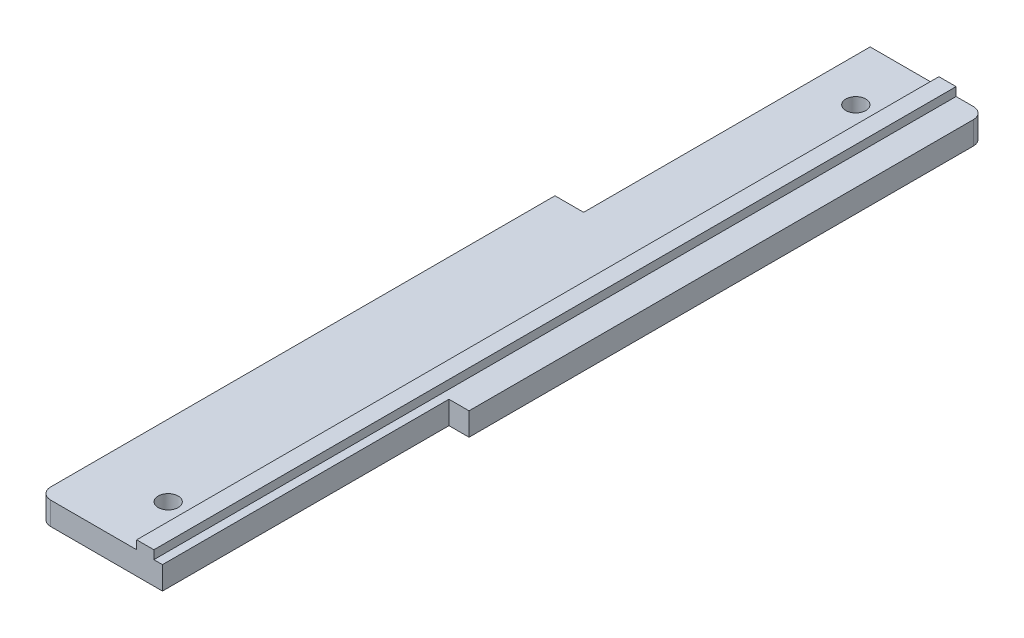
ISO-10303-21;
HEADER;
FILE_DESCRIPTION(('STEP AP214'),'2;1');
FILE_NAME('part.step','',(''),(''),'','','');
FILE_SCHEMA(('AUTOMOTIVE_DESIGN { 1 0 10303 214 1 1 1 1 }'));
ENDSEC;
DATA;
#1=APPLICATION_CONTEXT('core data for automotive mechanical design processes');
#2=APPLICATION_PROTOCOL_DEFINITION('international standard','automotive_design',2000,#1);
#3=PRODUCT_CONTEXT('',#1,'mechanical');
#4=PRODUCT('Part','Part','',(#3));
#5=PRODUCT_RELATED_PRODUCT_CATEGORY('part','',(#4));
#6=PRODUCT_DEFINITION_FORMATION('','',#4);
#7=PRODUCT_DEFINITION_CONTEXT('part definition',#1,'design');
#8=PRODUCT_DEFINITION('design','',#6,#7);
#9=PRODUCT_DEFINITION_SHAPE('','',#8);
#10=(LENGTH_UNIT() NAMED_UNIT(*) SI_UNIT(.MILLI.,.METRE.));
#11=(NAMED_UNIT(*) PLANE_ANGLE_UNIT() SI_UNIT($,.RADIAN.));
#12=(NAMED_UNIT(*) SI_UNIT($,.STERADIAN.) SOLID_ANGLE_UNIT());
#13=UNCERTAINTY_MEASURE_WITH_UNIT(LENGTH_MEASURE(1.E-05),#10,'distance_accuracy_value','');
#14=(GEOMETRIC_REPRESENTATION_CONTEXT(3) GLOBAL_UNCERTAINTY_ASSIGNED_CONTEXT((#13)) GLOBAL_UNIT_ASSIGNED_CONTEXT((#10,
#11,#12)) REPRESENTATION_CONTEXT('',''));
#15=CARTESIAN_POINT('',(0.,0.,0.));
#16=DIRECTION('',(0.,0.,1.));
#17=DIRECTION('',(1.,0.,0.));
#18=AXIS2_PLACEMENT_3D('',#15,#16,#17);
#19=CARTESIAN_POINT('',(0.,4.,0.));
#20=DIRECTION('',(0.,-1.,0.));
#21=DIRECTION('',(0.,0.,-1.));
#22=AXIS2_PLACEMENT_3D('',#19,#20,#21);
#23=PLANE('',#22);
#24=CARTESIAN_POINT('',(0.,4.,60.));
#25=DIRECTION('',(0.,1.,0.));
#26=DIRECTION('',(0.,0.,-1.));
#27=AXIS2_PLACEMENT_3D('',#24,#25,#26);
#28=CIRCLE('',#27,1.75);
#29=CARTESIAN_POINT('',(0.,4.,58.25));
#30=VERTEX_POINT('',#29);
#31=EDGE_CURVE('E176',#30,#30,#28,.T.);
#32=ORIENTED_EDGE('',*,*,#31,.F.);
#33=EDGE_LOOP('',(#32));
#34=FACE_BOUND('',#33,.T.);
#35=CARTESIAN_POINT('',(0.,4.,-60.));
#36=DIRECTION('',(0.,1.,0.));
#37=DIRECTION('',(0.,0.,1.));
#38=AXIS2_PLACEMENT_3D('',#35,#36,#37);
#39=CIRCLE('',#38,1.75);
#40=CARTESIAN_POINT('',(0.,4.,-58.25));
#41=VERTEX_POINT('',#40);
#42=EDGE_CURVE('E215',#41,#41,#39,.T.);
#43=ORIENTED_EDGE('',*,*,#42,.F.);
#44=EDGE_LOOP('',(#43));
#45=FACE_BOUND('',#44,.T.);
#46=DIRECTION('',(-1.,0.,0.));
#47=VECTOR('',#46,1.);
#48=CARTESIAN_POINT('',(-12.5,4.,-70.));
#49=LINE('',#48,#47);
#50=CARTESIAN_POINT('',(4.50000000000001,4.,-70.));
#51=VERTEX_POINT('',#50);
#52=CARTESIAN_POINT('',(-7.5,4.,-70.));
#53=VERTEX_POINT('',#52);
#54=EDGE_CURVE('E166',#51,#53,#49,.T.);
#55=ORIENTED_EDGE('',*,*,#54,.T.);
#56=DIRECTION('',(0.,0.,-1.));
#57=VECTOR('',#56,1.);
#58=CARTESIAN_POINT('',(-7.5,4.,-70.));
#59=LINE('',#58,#57);
#60=CARTESIAN_POINT('',(-7.49999999999999,4.,-20.));
#61=VERTEX_POINT('',#60);
#62=EDGE_CURVE('E283',#61,#53,#59,.T.);
#63=ORIENTED_EDGE('',*,*,#62,.F.);
#64=DIRECTION('',(1.,0.,0.));
#65=VECTOR('',#64,1.);
#66=CARTESIAN_POINT('',(-7.49999999999999,4.,-20.));
#67=LINE('',#66,#65);
#68=CARTESIAN_POINT('',(-12.5,4.,-20.));
#69=VERTEX_POINT('',#68);
#70=EDGE_CURVE('E309',#69,#61,#67,.T.);
#71=ORIENTED_EDGE('',*,*,#70,.F.);
#72=DIRECTION('',(0.,0.,1.));
#73=VECTOR('',#72,1.);
#74=CARTESIAN_POINT('',(-12.5,4.,70.));
#75=LINE('',#74,#73);
#76=CARTESIAN_POINT('',(-12.5,4.,68.));
#77=VERTEX_POINT('',#76);
#78=EDGE_CURVE('E179',#69,#77,#75,.T.);
#79=ORIENTED_EDGE('',*,*,#78,.T.);
#80=CARTESIAN_POINT('',(-10.5,4.,68.));
#81=DIRECTION('',(0.,-1.,0.));
#82=DIRECTION('',(0.,0.,-1.));
#83=AXIS2_PLACEMENT_3D('',#80,#81,#82);
#84=CIRCLE('',#83,2.);
#85=CARTESIAN_POINT('',(-10.5,4.,70.));
#86=VERTEX_POINT('',#85);
#87=EDGE_CURVE('E201',#77,#86,#84,.F.);
#88=ORIENTED_EDGE('',*,*,#87,.T.);
#89=DIRECTION('',(1.,0.,0.));
#90=VECTOR('',#89,1.);
#91=CARTESIAN_POINT('',(-12.5,4.,70.));
#92=LINE('',#91,#90);
#93=CARTESIAN_POINT('',(4.50000000000001,4.,70.));
#94=VERTEX_POINT('',#93);
#95=EDGE_CURVE('E182',#86,#94,#92,.T.);
#96=ORIENTED_EDGE('',*,*,#95,.T.);
#97=DIRECTION('',(0.,0.,1.));
#98=VECTOR('',#97,1.);
#99=CARTESIAN_POINT('',(4.5,4.,-70.));
#100=LINE('',#99,#98);
#101=EDGE_CURVE('E239',#51,#94,#100,.T.);
#102=ORIENTED_EDGE('',*,*,#101,.F.);
#103=EDGE_LOOP('',(#55,#63,#71,#79,#88,#96,#102));
#104=FACE_BOUND('',#103,.T.);
#105=ADVANCED_FACE('F47',(#34,#45,#104),#23,.F.);
#106=CARTESIAN_POINT('',(7.50000000000001,4.,70.));
#107=VERTEX_POINT('',#106);
#108=CARTESIAN_POINT('',(9.00000000000001,4.,70.));
#109=VERTEX_POINT('',#108);
#110=EDGE_CURVE('E181',#107,#109,#92,.T.);
#111=ORIENTED_EDGE('',*,*,#110,.T.);
#112=DIRECTION('',(0.,0.,1.));
#113=VECTOR('',#112,1.);
#114=CARTESIAN_POINT('',(9.,4.,20.));
#115=LINE('',#114,#113);
#116=CARTESIAN_POINT('',(9.,4.,20.));
#117=VERTEX_POINT('',#116);
#118=EDGE_CURVE('E154',#117,#109,#115,.T.);
#119=ORIENTED_EDGE('',*,*,#118,.F.);
#120=DIRECTION('',(-1.,0.,0.));
#121=VECTOR('',#120,1.);
#122=CARTESIAN_POINT('',(12.5,4.,20.));
#123=LINE('',#122,#121);
#124=CARTESIAN_POINT('',(12.5,4.,20.));
#125=VERTEX_POINT('',#124);
#126=EDGE_CURVE('E148',#125,#117,#123,.T.);
#127=ORIENTED_EDGE('',*,*,#126,.F.);
#128=DIRECTION('',(0.,0.,-1.));
#129=VECTOR('',#128,1.);
#130=CARTESIAN_POINT('',(12.5,4.,70.));
#131=LINE('',#130,#129);
#132=CARTESIAN_POINT('',(12.5,4.,-68.));
#133=VERTEX_POINT('',#132);
#134=EDGE_CURVE('E159',#125,#133,#131,.T.);
#135=ORIENTED_EDGE('',*,*,#134,.T.);
#136=CARTESIAN_POINT('',(10.5,4.,-68.));
#137=DIRECTION('',(0.,-1.,0.));
#138=DIRECTION('',(0.,0.,-1.));
#139=AXIS2_PLACEMENT_3D('',#136,#137,#138);
#140=CIRCLE('',#139,2.);
#141=CARTESIAN_POINT('',(10.5,4.,-70.));
#142=VERTEX_POINT('',#141);
#143=EDGE_CURVE('E203',#133,#142,#140,.F.);
#144=ORIENTED_EDGE('',*,*,#143,.T.);
#145=CARTESIAN_POINT('',(7.5,4.,-70.));
#146=VERTEX_POINT('',#145);
#147=EDGE_CURVE('E170',#142,#146,#49,.T.);
#148=ORIENTED_EDGE('',*,*,#147,.T.);
#149=DIRECTION('',(0.,0.,-1.));
#150=VECTOR('',#149,1.);
#151=CARTESIAN_POINT('',(7.5,4.,-70.));
#152=LINE('',#151,#150);
#153=EDGE_CURVE('E242',#107,#146,#152,.T.);
#154=ORIENTED_EDGE('',*,*,#153,.F.);
#155=EDGE_LOOP('',(#111,#119,#127,#135,#144,#148,#154));
#156=FACE_BOUND('',#155,.T.);
#157=ADVANCED_FACE('F158',(#156),#23,.F.);
#158=CARTESIAN_POINT('',(12.5,4.,70.));
#159=DIRECTION('',(-1.,0.,0.));
#160=DIRECTION('',(0.,0.,1.));
#161=AXIS2_PLACEMENT_3D('',#158,#159,#160);
#162=PLANE('',#161);
#163=ORIENTED_EDGE('',*,*,#134,.F.);
#164=DIRECTION('',(0.,1.,0.));
#165=VECTOR('',#164,1.);
#166=CARTESIAN_POINT('',(12.5,-41.,20.));
#167=LINE('',#166,#165);
#168=CARTESIAN_POINT('',(12.5,0.,20.));
#169=VERTEX_POINT('',#168);
#170=EDGE_CURVE('E145',#169,#125,#167,.T.);
#171=ORIENTED_EDGE('',*,*,#170,.F.);
#172=DIRECTION('',(0.,0.,-1.));
#173=VECTOR('',#172,1.);
#174=CARTESIAN_POINT('',(12.5,0.,70.));
#175=LINE('',#174,#173);
#176=CARTESIAN_POINT('',(12.5,0.,-68.));
#177=VERTEX_POINT('',#176);
#178=EDGE_CURVE('E185',#169,#177,#175,.T.);
#179=ORIENTED_EDGE('',*,*,#178,.T.);
#180=DIRECTION('',(0.,-1.,0.));
#181=VECTOR('',#180,1.);
#182=CARTESIAN_POINT('',(12.5,4.,-68.));
#183=LINE('',#182,#181);
#184=EDGE_CURVE('E164',#177,#133,#183,.F.);
#185=ORIENTED_EDGE('',*,*,#184,.T.);
#186=EDGE_LOOP('',(#163,#171,#179,#185));
#187=FACE_BOUND('',#186,.T.);
#188=ADVANCED_FACE('F162',(#187),#162,.F.);
#189=CARTESIAN_POINT('',(-12.5,4.,-70.));
#190=DIRECTION('',(0.,0.,1.));
#191=DIRECTION('',(1.,0.,0.));
#192=AXIS2_PLACEMENT_3D('',#189,#190,#191);
#193=PLANE('',#192);
#194=DIRECTION('',(-1.,0.,0.));
#195=VECTOR('',#194,1.);
#196=CARTESIAN_POINT('',(-12.5,0.,-70.));
#197=LINE('',#196,#195);
#198=CARTESIAN_POINT('',(10.5,0.,-70.));
#199=VERTEX_POINT('',#198);
#200=CARTESIAN_POINT('',(-7.5,0.,-70.));
#201=VERTEX_POINT('',#200);
#202=EDGE_CURVE('E187',#199,#201,#197,.T.);
#203=ORIENTED_EDGE('',*,*,#202,.T.);
#204=DIRECTION('',(0.,1.,0.));
#205=VECTOR('',#204,1.);
#206=CARTESIAN_POINT('',(-7.5,-6.,-70.));
#207=LINE('',#206,#205);
#208=EDGE_CURVE('E225',#201,#53,#207,.T.);
#209=ORIENTED_EDGE('',*,*,#208,.T.);
#210=ORIENTED_EDGE('',*,*,#54,.F.);
#211=DIRECTION('',(0.,-1.,0.));
#212=VECTOR('',#211,1.);
#213=CARTESIAN_POINT('',(4.5,5.5,-70.));
#214=LINE('',#213,#212);
#215=CARTESIAN_POINT('',(4.5,5.5,-70.));
#216=VERTEX_POINT('',#215);
#217=EDGE_CURVE('E255',#216,#51,#214,.T.);
#218=ORIENTED_EDGE('',*,*,#217,.F.);
#219=DIRECTION('',(-1.,0.,0.));
#220=VECTOR('',#219,1.);
#221=CARTESIAN_POINT('',(4.5,5.5,-70.));
#222=LINE('',#221,#220);
#223=CARTESIAN_POINT('',(7.5,5.5,-70.));
#224=VERTEX_POINT('',#223);
#225=EDGE_CURVE('E254',#224,#216,#222,.T.);
#226=ORIENTED_EDGE('',*,*,#225,.F.);
#227=DIRECTION('',(0.,-1.,0.));
#228=VECTOR('',#227,1.);
#229=CARTESIAN_POINT('',(7.5,5.5,-70.));
#230=LINE('',#229,#228);
#231=EDGE_CURVE('E261',#224,#146,#230,.T.);
#232=ORIENTED_EDGE('',*,*,#231,.T.);
#233=ORIENTED_EDGE('',*,*,#147,.F.);
#234=DIRECTION('',(0.,-1.,0.));
#235=VECTOR('',#234,1.);
#236=CARTESIAN_POINT('',(10.5,4.,-70.));
#237=LINE('',#236,#235);
#238=EDGE_CURVE('E184',#142,#199,#237,.T.);
#239=ORIENTED_EDGE('',*,*,#238,.T.);
#240=EDGE_LOOP('',(#203,#209,#210,#218,#226,#232,#233,#239));
#241=FACE_BOUND('',#240,.T.);
#242=ADVANCED_FACE('F286',(#241),#193,.F.);
#243=CARTESIAN_POINT('',(-12.5,4.,70.));
#244=DIRECTION('',(1.,0.,0.));
#245=DIRECTION('',(0.,0.,-1.));
#246=AXIS2_PLACEMENT_3D('',#243,#244,#245);
#247=PLANE('',#246);
#248=ORIENTED_EDGE('',*,*,#78,.F.);
#249=DIRECTION('',(0.,-1.,0.));
#250=VECTOR('',#249,1.);
#251=CARTESIAN_POINT('',(-12.5,4.,-20.));
#252=LINE('',#251,#250);
#253=CARTESIAN_POINT('',(-12.5,0.,-20.));
#254=VERTEX_POINT('',#253);
#255=EDGE_CURVE('E234',#69,#254,#252,.T.);
#256=ORIENTED_EDGE('',*,*,#255,.T.);
#257=DIRECTION('',(0.,0.,1.));
#258=VECTOR('',#257,1.);
#259=CARTESIAN_POINT('',(-12.5,0.,70.));
#260=LINE('',#259,#258);
#261=CARTESIAN_POINT('',(-12.5,0.,68.));
#262=VERTEX_POINT('',#261);
#263=EDGE_CURVE('E173',#254,#262,#260,.T.);
#264=ORIENTED_EDGE('',*,*,#263,.T.);
#265=DIRECTION('',(0.,-1.,0.));
#266=VECTOR('',#265,1.);
#267=CARTESIAN_POINT('',(-12.5,4.,68.));
#268=LINE('',#267,#266);
#269=EDGE_CURVE('E205',#262,#77,#268,.F.);
#270=ORIENTED_EDGE('',*,*,#269,.T.);
#271=EDGE_LOOP('',(#248,#256,#264,#270));
#272=FACE_BOUND('',#271,.T.);
#273=ADVANCED_FACE('F238',(#272),#247,.F.);
#274=CARTESIAN_POINT('',(-12.5,4.,70.));
#275=DIRECTION('',(0.,0.,-1.));
#276=DIRECTION('',(-1.,0.,0.));
#277=AXIS2_PLACEMENT_3D('',#274,#275,#276);
#278=PLANE('',#277);
#279=DIRECTION('',(1.,0.,0.));
#280=VECTOR('',#279,1.);
#281=CARTESIAN_POINT('',(-12.5,0.,70.));
#282=LINE('',#281,#280);
#283=CARTESIAN_POINT('',(-10.5,0.,70.));
#284=VERTEX_POINT('',#283);
#285=CARTESIAN_POINT('',(9.00000000000001,0.,70.));
#286=VERTEX_POINT('',#285);
#287=EDGE_CURVE('E167',#284,#286,#282,.T.);
#288=ORIENTED_EDGE('',*,*,#287,.T.);
#289=DIRECTION('',(0.,1.,0.));
#290=VECTOR('',#289,1.);
#291=CARTESIAN_POINT('',(9.00000000000001,-41.,70.));
#292=LINE('',#291,#290);
#293=EDGE_CURVE('E305',#286,#109,#292,.T.);
#294=ORIENTED_EDGE('',*,*,#293,.T.);
#295=ORIENTED_EDGE('',*,*,#110,.F.);
#296=DIRECTION('',(0.,-1.,0.));
#297=VECTOR('',#296,1.);
#298=CARTESIAN_POINT('',(7.50000000000002,5.5,70.));
#299=LINE('',#298,#297);
#300=CARTESIAN_POINT('',(7.50000000000002,5.5,70.));
#301=VERTEX_POINT('',#300);
#302=EDGE_CURVE('E264',#301,#107,#299,.T.);
#303=ORIENTED_EDGE('',*,*,#302,.F.);
#304=DIRECTION('',(1.,0.,0.));
#305=VECTOR('',#304,1.);
#306=CARTESIAN_POINT('',(4.50000000000002,5.5,70.));
#307=LINE('',#306,#305);
#308=CARTESIAN_POINT('',(4.50000000000002,5.5,70.));
#309=VERTEX_POINT('',#308);
#310=EDGE_CURVE('E250',#309,#301,#307,.T.);
#311=ORIENTED_EDGE('',*,*,#310,.F.);
#312=DIRECTION('',(0.,-1.,0.));
#313=VECTOR('',#312,1.);
#314=CARTESIAN_POINT('',(4.50000000000002,5.5,70.));
#315=LINE('',#314,#313);
#316=EDGE_CURVE('E267',#309,#94,#315,.T.);
#317=ORIENTED_EDGE('',*,*,#316,.T.);
#318=ORIENTED_EDGE('',*,*,#95,.F.);
#319=DIRECTION('',(0.,-1.,0.));
#320=VECTOR('',#319,1.);
#321=CARTESIAN_POINT('',(-10.5,4.,70.));
#322=LINE('',#321,#320);
#323=EDGE_CURVE('E208',#86,#284,#322,.T.);
#324=ORIENTED_EDGE('',*,*,#323,.T.);
#325=EDGE_LOOP('',(#288,#294,#295,#303,#311,#317,#318,#324));
#326=FACE_BOUND('',#325,.T.);
#327=ADVANCED_FACE('F304',(#326),#278,.F.);
#328=CARTESIAN_POINT('',(0.,0.,0.));
#329=DIRECTION('',(0.,-1.,0.));
#330=DIRECTION('',(0.,0.,-1.));
#331=AXIS2_PLACEMENT_3D('',#328,#329,#330);
#332=PLANE('',#331);
#333=DIRECTION('',(0.,0.,-1.));
#334=VECTOR('',#333,1.);
#335=CARTESIAN_POINT('',(8.99999999999999,0.,0.));
#336=LINE('',#335,#334);
#337=CARTESIAN_POINT('',(9.,0.,20.));
#338=VERTEX_POINT('',#337);
#339=EDGE_CURVE('E11',#286,#338,#336,.T.);
#340=ORIENTED_EDGE('',*,*,#339,.F.);
#341=ORIENTED_EDGE('',*,*,#287,.F.);
#342=CARTESIAN_POINT('',(-10.5,0.,68.));
#343=DIRECTION('',(0.,-1.,0.));
#344=DIRECTION('',(0.,0.,-1.));
#345=AXIS2_PLACEMENT_3D('',#342,#343,#344);
#346=CIRCLE('',#345,2.);
#347=EDGE_CURVE('E194',#284,#262,#346,.T.);
#348=ORIENTED_EDGE('',*,*,#347,.T.);
#349=ORIENTED_EDGE('',*,*,#263,.F.);
#350=DIRECTION('',(-1.,0.,0.));
#351=VECTOR('',#350,1.);
#352=CARTESIAN_POINT('',(0.,0.,-20.));
#353=LINE('',#352,#351);
#354=CARTESIAN_POINT('',(-7.49999999999999,0.,-20.));
#355=VERTEX_POINT('',#354);
#356=EDGE_CURVE('E211',#355,#254,#353,.T.);
#357=ORIENTED_EDGE('',*,*,#356,.F.);
#358=DIRECTION('',(0.,0.,1.));
#359=VECTOR('',#358,1.);
#360=CARTESIAN_POINT('',(-7.49999999999999,0.,0.));
#361=LINE('',#360,#359);
#362=EDGE_CURVE('E219',#201,#355,#361,.T.);
#363=ORIENTED_EDGE('',*,*,#362,.F.);
#364=ORIENTED_EDGE('',*,*,#202,.F.);
#365=CARTESIAN_POINT('',(10.5,0.,-68.));
#366=DIRECTION('',(0.,-1.,0.));
#367=DIRECTION('',(0.,0.,-1.));
#368=AXIS2_PLACEMENT_3D('',#365,#366,#367);
#369=CIRCLE('',#368,2.);
#370=EDGE_CURVE('E197',#199,#177,#369,.T.);
#371=ORIENTED_EDGE('',*,*,#370,.T.);
#372=ORIENTED_EDGE('',*,*,#178,.F.);
#373=DIRECTION('',(1.,0.,0.));
#374=VECTOR('',#373,1.);
#375=CARTESIAN_POINT('',(0.,0.,20.));
#376=LINE('',#375,#374);
#377=EDGE_CURVE('E55',#338,#169,#376,.T.);
#378=ORIENTED_EDGE('',*,*,#377,.F.);
#379=EDGE_LOOP('',(#340,#341,#348,#349,#357,#363,#364,#371,#372,#378));
#380=FACE_BOUND('',#379,.T.);
#381=CARTESIAN_POINT('',(0.,0.,-60.));
#382=DIRECTION('',(0.,-1.,0.));
#383=DIRECTION('',(0.,0.,-1.));
#384=AXIS2_PLACEMENT_3D('',#381,#382,#383);
#385=CIRCLE('',#384,1.75);
#386=CARTESIAN_POINT('',(0.,0.,-61.75));
#387=VERTEX_POINT('',#386);
#388=EDGE_CURVE('E188',#387,#387,#385,.T.);
#389=ORIENTED_EDGE('',*,*,#388,.F.);
#390=EDGE_LOOP('',(#389));
#391=FACE_BOUND('',#390,.T.);
#392=CARTESIAN_POINT('',(0.,0.,60.));
#393=DIRECTION('',(0.,-1.,0.));
#394=DIRECTION('',(0.,0.,-1.));
#395=AXIS2_PLACEMENT_3D('',#392,#393,#394);
#396=CIRCLE('',#395,1.75);
#397=CARTESIAN_POINT('',(0.,0.,58.25));
#398=VERTEX_POINT('',#397);
#399=EDGE_CURVE('E212',#398,#398,#396,.T.);
#400=ORIENTED_EDGE('',*,*,#399,.F.);
#401=EDGE_LOOP('',(#400));
#402=FACE_BOUND('',#401,.T.);
#403=ADVANCED_FACE('F230',(#380,#391,#402),#332,.T.);
#404=CARTESIAN_POINT('',(10.5,4.,-68.));
#405=DIRECTION('',(0.,-1.,0.));
#406=DIRECTION('',(0.,0.,-1.));
#407=AXIS2_PLACEMENT_3D('',#404,#405,#406);
#408=CYLINDRICAL_SURFACE('',#407,2.);
#409=ORIENTED_EDGE('',*,*,#143,.F.);
#410=ORIENTED_EDGE('',*,*,#184,.F.);
#411=ORIENTED_EDGE('',*,*,#370,.F.);
#412=ORIENTED_EDGE('',*,*,#238,.F.);
#413=EDGE_LOOP('',(#409,#410,#411,#412));
#414=FACE_BOUND('',#413,.T.);
#415=ADVANCED_FACE('F346',(#414),#408,.T.);
#416=CARTESIAN_POINT('',(-10.5,4.,68.));
#417=DIRECTION('',(0.,-1.,0.));
#418=DIRECTION('',(0.,0.,-1.));
#419=AXIS2_PLACEMENT_3D('',#416,#417,#418);
#420=CYLINDRICAL_SURFACE('',#419,2.);
#421=ORIENTED_EDGE('',*,*,#87,.F.);
#422=ORIENTED_EDGE('',*,*,#269,.F.);
#423=ORIENTED_EDGE('',*,*,#347,.F.);
#424=ORIENTED_EDGE('',*,*,#323,.F.);
#425=EDGE_LOOP('',(#421,#422,#423,#424));
#426=FACE_BOUND('',#425,.T.);
#427=ADVANCED_FACE('F49',(#426),#420,.T.);
#428=CARTESIAN_POINT('',(0.,-6.,60.));
#429=DIRECTION('',(0.,1.,0.));
#430=DIRECTION('',(0.,0.,1.));
#431=AXIS2_PLACEMENT_3D('',#428,#429,#430);
#432=CYLINDRICAL_SURFACE('',#431,1.75);
#433=ORIENTED_EDGE('',*,*,#399,.T.);
#434=EDGE_LOOP('',(#433));
#435=FACE_BOUND('',#434,.T.);
#436=ORIENTED_EDGE('',*,*,#31,.T.);
#437=EDGE_LOOP('',(#436));
#438=FACE_BOUND('',#437,.T.);
#439=ADVANCED_FACE('F275',(#435,#438),#432,.F.);
#440=CARTESIAN_POINT('',(0.,-6.,-60.));
#441=DIRECTION('',(0.,1.,0.));
#442=DIRECTION('',(0.,0.,1.));
#443=AXIS2_PLACEMENT_3D('',#440,#441,#442);
#444=CYLINDRICAL_SURFACE('',#443,1.75);
#445=ORIENTED_EDGE('',*,*,#388,.T.);
#446=EDGE_LOOP('',(#445));
#447=FACE_BOUND('',#446,.T.);
#448=ORIENTED_EDGE('',*,*,#42,.T.);
#449=EDGE_LOOP('',(#448));
#450=FACE_BOUND('',#449,.T.);
#451=ADVANCED_FACE('F338',(#447,#450),#444,.F.);
#452=CARTESIAN_POINT('',(4.5,5.5,-70.));
#453=DIRECTION('',(1.,0.,0.));
#454=DIRECTION('',(0.,0.,-1.));
#455=AXIS2_PLACEMENT_3D('',#452,#453,#454);
#456=PLANE('',#455);
#457=ORIENTED_EDGE('',*,*,#101,.T.);
#458=ORIENTED_EDGE('',*,*,#316,.F.);
#459=DIRECTION('',(0.,0.,1.));
#460=VECTOR('',#459,1.);
#461=CARTESIAN_POINT('',(4.5,5.5,-70.));
#462=LINE('',#461,#460);
#463=EDGE_CURVE('E247',#216,#309,#462,.T.);
#464=ORIENTED_EDGE('',*,*,#463,.F.);
#465=ORIENTED_EDGE('',*,*,#217,.T.);
#466=EDGE_LOOP('',(#457,#458,#464,#465));
#467=FACE_BOUND('',#466,.T.);
#468=ADVANCED_FACE('F290',(#467),#456,.F.);
#469=CARTESIAN_POINT('',(7.5,5.5,-70.));
#470=DIRECTION('',(-1.,0.,0.));
#471=DIRECTION('',(0.,0.,1.));
#472=AXIS2_PLACEMENT_3D('',#469,#470,#471);
#473=PLANE('',#472);
#474=ORIENTED_EDGE('',*,*,#153,.T.);
#475=ORIENTED_EDGE('',*,*,#231,.F.);
#476=DIRECTION('',(0.,0.,-1.));
#477=VECTOR('',#476,1.);
#478=CARTESIAN_POINT('',(7.5,5.5,-70.));
#479=LINE('',#478,#477);
#480=EDGE_CURVE('E252',#301,#224,#479,.T.);
#481=ORIENTED_EDGE('',*,*,#480,.F.);
#482=ORIENTED_EDGE('',*,*,#302,.T.);
#483=EDGE_LOOP('',(#474,#475,#481,#482));
#484=FACE_BOUND('',#483,.T.);
#485=ADVANCED_FACE('F300',(#484),#473,.F.);
#486=CARTESIAN_POINT('',(0.,5.5,0.));
#487=DIRECTION('',(0.,1.,0.));
#488=DIRECTION('',(0.,0.,1.));
#489=AXIS2_PLACEMENT_3D('',#486,#487,#488);
#490=PLANE('',#489);
#491=ORIENTED_EDGE('',*,*,#463,.T.);
#492=ORIENTED_EDGE('',*,*,#310,.T.);
#493=ORIENTED_EDGE('',*,*,#480,.T.);
#494=ORIENTED_EDGE('',*,*,#225,.T.);
#495=EDGE_LOOP('',(#491,#492,#493,#494));
#496=FACE_BOUND('',#495,.T.);
#497=ADVANCED_FACE('F293',(#496),#490,.T.);
#498=CARTESIAN_POINT('',(-7.49999999999999,-6.,-20.));
#499=DIRECTION('',(0.,0.,1.));
#500=DIRECTION('',(1.,0.,0.));
#501=AXIS2_PLACEMENT_3D('',#498,#499,#500);
#502=PLANE('',#501);
#503=ORIENTED_EDGE('',*,*,#70,.T.);
#504=DIRECTION('',(0.,1.,0.));
#505=VECTOR('',#504,1.);
#506=CARTESIAN_POINT('',(-7.49999999999999,-6.,-20.));
#507=LINE('',#506,#505);
#508=EDGE_CURVE('E69',#355,#61,#507,.T.);
#509=ORIENTED_EDGE('',*,*,#508,.F.);
#510=ORIENTED_EDGE('',*,*,#356,.T.);
#511=ORIENTED_EDGE('',*,*,#255,.F.);
#512=EDGE_LOOP('',(#503,#509,#510,#511));
#513=FACE_BOUND('',#512,.T.);
#514=ADVANCED_FACE('F233',(#513),#502,.F.);
#515=CARTESIAN_POINT('',(-7.5,-6.,-70.));
#516=DIRECTION('',(1.,0.,0.));
#517=DIRECTION('',(0.,0.,-1.));
#518=AXIS2_PLACEMENT_3D('',#515,#516,#517);
#519=PLANE('',#518);
#520=ORIENTED_EDGE('',*,*,#362,.T.);
#521=ORIENTED_EDGE('',*,*,#508,.T.);
#522=ORIENTED_EDGE('',*,*,#62,.T.);
#523=ORIENTED_EDGE('',*,*,#208,.F.);
#524=EDGE_LOOP('',(#520,#521,#522,#523));
#525=FACE_BOUND('',#524,.T.);
#526=ADVANCED_FACE('F223',(#525),#519,.F.);
#527=CARTESIAN_POINT('',(9.,-41.,20.));
#528=DIRECTION('',(-1.,0.,0.));
#529=DIRECTION('',(0.,0.,1.));
#530=AXIS2_PLACEMENT_3D('',#527,#528,#529);
#531=PLANE('',#530);
#532=ORIENTED_EDGE('',*,*,#339,.T.);
#533=DIRECTION('',(0.,1.,0.));
#534=VECTOR('',#533,1.);
#535=CARTESIAN_POINT('',(9.,-41.,20.));
#536=LINE('',#535,#534);
#537=EDGE_CURVE('E62',#338,#117,#536,.T.);
#538=ORIENTED_EDGE('',*,*,#537,.T.);
#539=ORIENTED_EDGE('',*,*,#118,.T.);
#540=ORIENTED_EDGE('',*,*,#293,.F.);
#541=EDGE_LOOP('',(#532,#538,#539,#540));
#542=FACE_BOUND('',#541,.T.);
#543=ADVANCED_FACE('F319',(#542),#531,.F.);
#544=CARTESIAN_POINT('',(12.5,-41.,20.));
#545=DIRECTION('',(0.,0.,-1.));
#546=DIRECTION('',(-1.,0.,0.));
#547=AXIS2_PLACEMENT_3D('',#544,#545,#546);
#548=PLANE('',#547);
#549=ORIENTED_EDGE('',*,*,#377,.T.);
#550=ORIENTED_EDGE('',*,*,#170,.T.);
#551=ORIENTED_EDGE('',*,*,#126,.T.);
#552=ORIENTED_EDGE('',*,*,#537,.F.);
#553=EDGE_LOOP('',(#549,#550,#551,#552));
#554=FACE_BOUND('',#553,.T.);
#555=ADVANCED_FACE('F147',(#554),#548,.F.);
#556=CLOSED_SHELL('',(#105,#157,#188,#242,#273,#327,#403,#415,#427,#439,#451,#468,#485,#497,
#514,#526,#543,#555));
#557=MANIFOLD_SOLID_BREP('B2',#556);
#558=ADVANCED_BREP_SHAPE_REPRESENTATION('',(#18,#557),#14);
#559=SHAPE_DEFINITION_REPRESENTATION(#9,#558);
ENDSEC;
END-ISO-10303-21;
